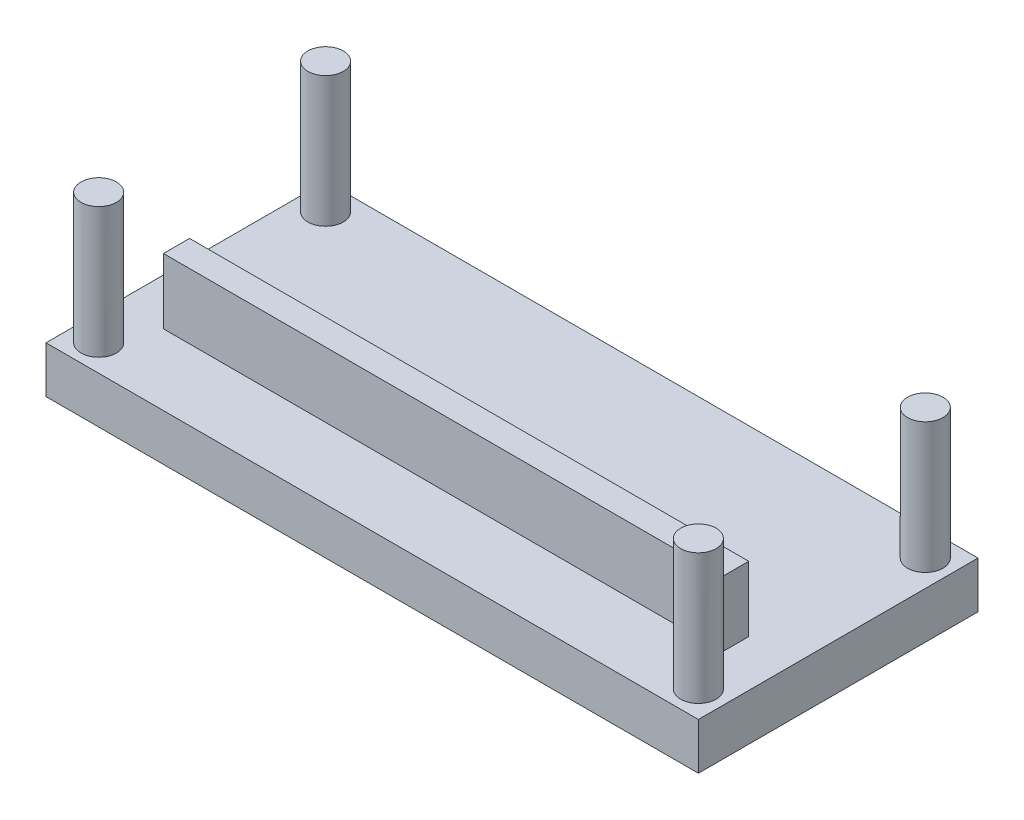
ISO-10303-21;
HEADER;
FILE_DESCRIPTION(('STEP AP214'),'2;1');
FILE_NAME('part.step','',(''),(''),'','','');
FILE_SCHEMA(('AUTOMOTIVE_DESIGN { 1 0 10303 214 1 1 1 1 }'));
ENDSEC;
DATA;
#1=APPLICATION_CONTEXT('core data for automotive mechanical design processes');
#2=APPLICATION_PROTOCOL_DEFINITION('international standard','automotive_design',2000,#1);
#3=PRODUCT_CONTEXT('',#1,'mechanical');
#4=PRODUCT('Part','Part','',(#3));
#5=PRODUCT_RELATED_PRODUCT_CATEGORY('part','',(#4));
#6=PRODUCT_DEFINITION_FORMATION('','',#4);
#7=PRODUCT_DEFINITION_CONTEXT('part definition',#1,'design');
#8=PRODUCT_DEFINITION('design','',#6,#7);
#9=PRODUCT_DEFINITION_SHAPE('','',#8);
#10=(LENGTH_UNIT() NAMED_UNIT(*) SI_UNIT(.MILLI.,.METRE.));
#11=(NAMED_UNIT(*) PLANE_ANGLE_UNIT() SI_UNIT($,.RADIAN.));
#12=(NAMED_UNIT(*) SI_UNIT($,.STERADIAN.) SOLID_ANGLE_UNIT());
#13=UNCERTAINTY_MEASURE_WITH_UNIT(LENGTH_MEASURE(1.E-05),#10,'distance_accuracy_value','');
#14=(GEOMETRIC_REPRESENTATION_CONTEXT(3) GLOBAL_UNCERTAINTY_ASSIGNED_CONTEXT((#13)) GLOBAL_UNIT_ASSIGNED_CONTEXT((#10,
#11,#12)) REPRESENTATION_CONTEXT('',''));
#15=CARTESIAN_POINT('',(0.,0.,0.));
#16=DIRECTION('',(0.,0.,1.));
#17=DIRECTION('',(1.,0.,0.));
#18=AXIS2_PLACEMENT_3D('',#15,#16,#17);
#19=CARTESIAN_POINT('',(70.,15.,0.));
#20=DIRECTION('',(0.,0.,-1.));
#21=DIRECTION('',(-1.,0.,0.));
#22=AXIS2_PLACEMENT_3D('',#19,#20,#21);
#23=PLANE('',#22);
#24=DIRECTION('',(-1.,0.,0.));
#25=VECTOR('',#24,1.);
#26=CARTESIAN_POINT('',(70.,10.,0.));
#27=LINE('',#26,#25);
#28=CARTESIAN_POINT('',(70.,10.,0.));
#29=VERTEX_POINT('',#28);
#30=CARTESIAN_POINT('',(0.,10.,0.));
#31=VERTEX_POINT('',#30);
#32=EDGE_CURVE('E54',#29,#31,#27,.T.);
#33=ORIENTED_EDGE('',*,*,#32,.F.);
#34=DIRECTION('',(0.,-1.,0.));
#35=VECTOR('',#34,1.);
#36=CARTESIAN_POINT('',(70.,15.,0.));
#37=LINE('',#36,#35);
#38=CARTESIAN_POINT('',(70.,15.,0.));
#39=VERTEX_POINT('',#38);
#40=EDGE_CURVE('E131',#39,#29,#37,.T.);
#41=ORIENTED_EDGE('',*,*,#40,.F.);
#42=DIRECTION('',(1.,0.,0.));
#43=VECTOR('',#42,1.);
#44=CARTESIAN_POINT('',(70.,15.,0.));
#45=LINE('',#44,#43);
#46=CARTESIAN_POINT('',(0.,15.,0.));
#47=VERTEX_POINT('',#46);
#48=EDGE_CURVE('E164',#47,#39,#45,.T.);
#49=ORIENTED_EDGE('',*,*,#48,.F.);
#50=DIRECTION('',(0.,-1.,0.));
#51=VECTOR('',#50,1.);
#52=CARTESIAN_POINT('',(0.,15.,0.));
#53=LINE('',#52,#51);
#54=EDGE_CURVE('E127',#47,#31,#53,.T.);
#55=ORIENTED_EDGE('',*,*,#54,.T.);
#56=EDGE_LOOP('',(#33,#41,#49,#55));
#57=FACE_BOUND('',#56,.T.);
#58=ADVANCED_FACE('F39',(#57),#23,.F.);
#59=CARTESIAN_POINT('',(70.,15.,-30.));
#60=DIRECTION('',(-1.,0.,0.));
#61=DIRECTION('',(0.,0.,1.));
#62=AXIS2_PLACEMENT_3D('',#59,#60,#61);
#63=PLANE('',#62);
#64=DIRECTION('',(0.,0.,1.));
#65=VECTOR('',#64,1.);
#66=CARTESIAN_POINT('',(70.,10.,-30.));
#67=LINE('',#66,#65);
#68=CARTESIAN_POINT('',(70.,10.,-30.));
#69=VERTEX_POINT('',#68);
#70=EDGE_CURVE('E122',#69,#29,#67,.T.);
#71=ORIENTED_EDGE('',*,*,#70,.F.);
#72=DIRECTION('',(0.,-1.,0.));
#73=VECTOR('',#72,1.);
#74=CARTESIAN_POINT('',(70.,15.,-30.));
#75=LINE('',#74,#73);
#76=CARTESIAN_POINT('',(70.,15.,-30.));
#77=VERTEX_POINT('',#76);
#78=EDGE_CURVE('E120',#77,#69,#75,.T.);
#79=ORIENTED_EDGE('',*,*,#78,.F.);
#80=DIRECTION('',(0.,0.,-1.));
#81=VECTOR('',#80,1.);
#82=CARTESIAN_POINT('',(70.,15.,-30.));
#83=LINE('',#82,#81);
#84=EDGE_CURVE('E209',#39,#77,#83,.T.);
#85=ORIENTED_EDGE('',*,*,#84,.F.);
#86=ORIENTED_EDGE('',*,*,#40,.T.);
#87=EDGE_LOOP('',(#71,#79,#85,#86));
#88=FACE_BOUND('',#87,.T.);
#89=ADVANCED_FACE('F217',(#88),#63,.F.);
#90=CARTESIAN_POINT('',(0.,15.,-30.));
#91=DIRECTION('',(0.,0.,1.));
#92=DIRECTION('',(1.,0.,0.));
#93=AXIS2_PLACEMENT_3D('',#90,#91,#92);
#94=PLANE('',#93);
#95=DIRECTION('',(1.,0.,0.));
#96=VECTOR('',#95,1.);
#97=CARTESIAN_POINT('',(0.,10.,-30.));
#98=LINE('',#97,#96);
#99=CARTESIAN_POINT('',(0.,10.,-30.));
#100=VERTEX_POINT('',#99);
#101=EDGE_CURVE('E104',#100,#69,#98,.T.);
#102=ORIENTED_EDGE('',*,*,#101,.F.);
#103=DIRECTION('',(0.,-1.,0.));
#104=VECTOR('',#103,1.);
#105=CARTESIAN_POINT('',(0.,15.,-30.));
#106=LINE('',#105,#104);
#107=CARTESIAN_POINT('',(0.,15.,-30.));
#108=VERTEX_POINT('',#107);
#109=EDGE_CURVE('E117',#108,#100,#106,.T.);
#110=ORIENTED_EDGE('',*,*,#109,.F.);
#111=DIRECTION('',(-1.,0.,0.));
#112=VECTOR('',#111,1.);
#113=CARTESIAN_POINT('',(0.,15.,-30.));
#114=LINE('',#113,#112);
#115=EDGE_CURVE('E212',#77,#108,#114,.T.);
#116=ORIENTED_EDGE('',*,*,#115,.F.);
#117=ORIENTED_EDGE('',*,*,#78,.T.);
#118=EDGE_LOOP('',(#102,#110,#116,#117));
#119=FACE_BOUND('',#118,.T.);
#120=ADVANCED_FACE('F115',(#119),#94,.F.);
#121=CARTESIAN_POINT('',(0.,15.,0.));
#122=DIRECTION('',(1.,0.,0.));
#123=DIRECTION('',(0.,0.,-1.));
#124=AXIS2_PLACEMENT_3D('',#121,#122,#123);
#125=PLANE('',#124);
#126=DIRECTION('',(0.,0.,-1.));
#127=VECTOR('',#126,1.);
#128=CARTESIAN_POINT('',(0.,10.,0.));
#129=LINE('',#128,#127);
#130=EDGE_CURVE('E101',#31,#100,#129,.T.);
#131=ORIENTED_EDGE('',*,*,#130,.F.);
#132=ORIENTED_EDGE('',*,*,#54,.F.);
#133=DIRECTION('',(0.,0.,1.));
#134=VECTOR('',#133,1.);
#135=CARTESIAN_POINT('',(0.,15.,0.));
#136=LINE('',#135,#134);
#137=EDGE_CURVE('E125',#108,#47,#136,.T.);
#138=ORIENTED_EDGE('',*,*,#137,.F.);
#139=ORIENTED_EDGE('',*,*,#109,.T.);
#140=EDGE_LOOP('',(#131,#132,#138,#139));
#141=FACE_BOUND('',#140,.T.);
#142=ADVANCED_FACE('F124',(#141),#125,.F.);
#143=CARTESIAN_POINT('',(0.,15.,0.));
#144=DIRECTION('',(0.,-1.,0.));
#145=DIRECTION('',(0.,0.,-1.));
#146=AXIS2_PLACEMENT_3D('',#143,#144,#145);
#147=PLANE('',#146);
#148=CARTESIAN_POINT('',(67.1715728752538,15.,-2.8284271247462));
#149=DIRECTION('',(0.,-1.,0.));
#150=DIRECTION('',(0.,0.,-1.));
#151=AXIS2_PLACEMENT_3D('',#148,#149,#150);
#152=CIRCLE('',#151,1.9);
#153=CARTESIAN_POINT('',(67.1715728752538,15.,-4.7284271247462));
#154=VERTEX_POINT('',#153);
#155=EDGE_CURVE('E11',#154,#154,#152,.F.);
#156=ORIENTED_EDGE('',*,*,#155,.F.);
#157=EDGE_LOOP('',(#156));
#158=FACE_BOUND('',#157,.T.);
#159=CARTESIAN_POINT('',(67.1715728752538,15.,-27.1715728752538));
#160=DIRECTION('',(0.,-1.,0.));
#161=DIRECTION('',(0.,0.,-1.));
#162=AXIS2_PLACEMENT_3D('',#159,#160,#161);
#163=CIRCLE('',#162,1.9);
#164=CARTESIAN_POINT('',(67.1715728752538,15.,-29.0715728752538));
#165=VERTEX_POINT('',#164);
#166=EDGE_CURVE('E47',#165,#165,#163,.F.);
#167=ORIENTED_EDGE('',*,*,#166,.F.);
#168=EDGE_LOOP('',(#167));
#169=FACE_BOUND('',#168,.T.);
#170=CARTESIAN_POINT('',(2.82842712474619,15.,-27.1715728752538));
#171=DIRECTION('',(0.,-1.,0.));
#172=DIRECTION('',(0.,0.,-1.));
#173=AXIS2_PLACEMENT_3D('',#170,#171,#172);
#174=CIRCLE('',#173,1.9);
#175=CARTESIAN_POINT('',(2.82842712474619,15.,-29.0715728752538));
#176=VERTEX_POINT('',#175);
#177=EDGE_CURVE('E143',#176,#176,#174,.F.);
#178=ORIENTED_EDGE('',*,*,#177,.F.);
#179=EDGE_LOOP('',(#178));
#180=FACE_BOUND('',#179,.T.);
#181=CARTESIAN_POINT('',(2.82842712474619,15.,-2.82842712474619));
#182=DIRECTION('',(0.,-1.,0.));
#183=DIRECTION('',(0.,0.,-1.));
#184=AXIS2_PLACEMENT_3D('',#181,#182,#183);
#185=CIRCLE('',#184,1.9);
#186=CARTESIAN_POINT('',(2.82842712474619,15.,-4.72842712474619));
#187=VERTEX_POINT('',#186);
#188=EDGE_CURVE('E139',#187,#187,#185,.F.);
#189=ORIENTED_EDGE('',*,*,#188,.F.);
#190=EDGE_LOOP('',(#189));
#191=FACE_BOUND('',#190,.T.);
#192=ORIENTED_EDGE('',*,*,#48,.T.);
#193=ORIENTED_EDGE('',*,*,#84,.T.);
#194=ORIENTED_EDGE('',*,*,#115,.T.);
#195=ORIENTED_EDGE('',*,*,#137,.T.);
#196=EDGE_LOOP('',(#192,#193,#194,#195));
#197=FACE_BOUND('',#196,.T.);
#198=DIRECTION('',(1.,0.,0.));
#199=VECTOR('',#198,1.);
#200=CARTESIAN_POINT('',(5.,15.,-7.6));
#201=LINE('',#200,#199);
#202=CARTESIAN_POINT('',(5.,15.,-7.6));
#203=VERTEX_POINT('',#202);
#204=CARTESIAN_POINT('',(65.,15.,-7.6));
#205=VERTEX_POINT('',#204);
#206=EDGE_CURVE('E167',#203,#205,#201,.T.);
#207=ORIENTED_EDGE('',*,*,#206,.F.);
#208=DIRECTION('',(0.,0.,1.));
#209=VECTOR('',#208,1.);
#210=CARTESIAN_POINT('',(5.,15.,-10.4));
#211=LINE('',#210,#209);
#212=CARTESIAN_POINT('',(5.,15.,-10.4));
#213=VERTEX_POINT('',#212);
#214=EDGE_CURVE('E169',#213,#203,#211,.T.);
#215=ORIENTED_EDGE('',*,*,#214,.F.);
#216=DIRECTION('',(-1.,0.,0.));
#217=VECTOR('',#216,1.);
#218=CARTESIAN_POINT('',(65.,15.,-10.4));
#219=LINE('',#218,#217);
#220=CARTESIAN_POINT('',(65.,15.,-10.4));
#221=VERTEX_POINT('',#220);
#222=EDGE_CURVE('E187',#221,#213,#219,.T.);
#223=ORIENTED_EDGE('',*,*,#222,.F.);
#224=DIRECTION('',(0.,0.,-1.));
#225=VECTOR('',#224,1.);
#226=CARTESIAN_POINT('',(65.,15.,-7.6));
#227=LINE('',#226,#225);
#228=EDGE_CURVE('E62',#205,#221,#227,.T.);
#229=ORIENTED_EDGE('',*,*,#228,.F.);
#230=EDGE_LOOP('',(#207,#215,#223,#229));
#231=FACE_BOUND('',#230,.T.);
#232=ADVANCED_FACE('F152',(#158,#169,#180,#191,#197,#231),#147,.F.);
#233=CARTESIAN_POINT('',(5.,22.,-7.6));
#234=DIRECTION('',(0.,0.,-1.));
#235=DIRECTION('',(-1.,0.,0.));
#236=AXIS2_PLACEMENT_3D('',#233,#234,#235);
#237=PLANE('',#236);
#238=ORIENTED_EDGE('',*,*,#206,.T.);
#239=DIRECTION('',(0.,-1.,0.));
#240=VECTOR('',#239,1.);
#241=CARTESIAN_POINT('',(65.,22.,-7.6));
#242=LINE('',#241,#240);
#243=CARTESIAN_POINT('',(65.,22.,-7.6));
#244=VERTEX_POINT('',#243);
#245=EDGE_CURVE('E204',#244,#205,#242,.T.);
#246=ORIENTED_EDGE('',*,*,#245,.F.);
#247=DIRECTION('',(1.,0.,0.));
#248=VECTOR('',#247,1.);
#249=CARTESIAN_POINT('',(5.,22.,-7.6));
#250=LINE('',#249,#248);
#251=CARTESIAN_POINT('',(5.,22.,-7.6));
#252=VERTEX_POINT('',#251);
#253=EDGE_CURVE('E186',#252,#244,#250,.T.);
#254=ORIENTED_EDGE('',*,*,#253,.F.);
#255=DIRECTION('',(0.,-1.,0.));
#256=VECTOR('',#255,1.);
#257=CARTESIAN_POINT('',(5.,22.,-7.6));
#258=LINE('',#257,#256);
#259=EDGE_CURVE('E181',#252,#203,#258,.T.);
#260=ORIENTED_EDGE('',*,*,#259,.T.);
#261=EDGE_LOOP('',(#238,#246,#254,#260));
#262=FACE_BOUND('',#261,.T.);
#263=ADVANCED_FACE('F155',(#262),#237,.F.);
#264=CARTESIAN_POINT('',(65.,22.,-7.6));
#265=DIRECTION('',(-1.,0.,0.));
#266=DIRECTION('',(0.,0.,1.));
#267=AXIS2_PLACEMENT_3D('',#264,#265,#266);
#268=PLANE('',#267);
#269=ORIENTED_EDGE('',*,*,#228,.T.);
#270=DIRECTION('',(0.,-1.,0.));
#271=VECTOR('',#270,1.);
#272=CARTESIAN_POINT('',(65.,22.,-10.4));
#273=LINE('',#272,#271);
#274=CARTESIAN_POINT('',(65.,22.,-10.4));
#275=VERTEX_POINT('',#274);
#276=EDGE_CURVE('E195',#275,#221,#273,.T.);
#277=ORIENTED_EDGE('',*,*,#276,.F.);
#278=DIRECTION('',(0.,0.,-1.));
#279=VECTOR('',#278,1.);
#280=CARTESIAN_POINT('',(65.,22.,-7.6));
#281=LINE('',#280,#279);
#282=EDGE_CURVE('E223',#244,#275,#281,.T.);
#283=ORIENTED_EDGE('',*,*,#282,.F.);
#284=ORIENTED_EDGE('',*,*,#245,.T.);
#285=EDGE_LOOP('',(#269,#277,#283,#284));
#286=FACE_BOUND('',#285,.T.);
#287=ADVANCED_FACE('F235',(#286),#268,.F.);
#288=CARTESIAN_POINT('',(65.,22.,-10.4));
#289=DIRECTION('',(0.,0.,1.));
#290=DIRECTION('',(1.,0.,0.));
#291=AXIS2_PLACEMENT_3D('',#288,#289,#290);
#292=PLANE('',#291);
#293=ORIENTED_EDGE('',*,*,#222,.T.);
#294=DIRECTION('',(0.,-1.,0.));
#295=VECTOR('',#294,1.);
#296=CARTESIAN_POINT('',(5.,22.,-10.4));
#297=LINE('',#296,#295);
#298=CARTESIAN_POINT('',(5.,22.,-10.4));
#299=VERTEX_POINT('',#298);
#300=EDGE_CURVE('E184',#299,#213,#297,.T.);
#301=ORIENTED_EDGE('',*,*,#300,.F.);
#302=DIRECTION('',(-1.,0.,0.));
#303=VECTOR('',#302,1.);
#304=CARTESIAN_POINT('',(65.,22.,-10.4));
#305=LINE('',#304,#303);
#306=EDGE_CURVE('E197',#275,#299,#305,.T.);
#307=ORIENTED_EDGE('',*,*,#306,.F.);
#308=ORIENTED_EDGE('',*,*,#276,.T.);
#309=EDGE_LOOP('',(#293,#301,#307,#308));
#310=FACE_BOUND('',#309,.T.);
#311=ADVANCED_FACE('F231',(#310),#292,.F.);
#312=CARTESIAN_POINT('',(5.,22.,-10.4));
#313=DIRECTION('',(1.,0.,0.));
#314=DIRECTION('',(0.,0.,-1.));
#315=AXIS2_PLACEMENT_3D('',#312,#313,#314);
#316=PLANE('',#315);
#317=ORIENTED_EDGE('',*,*,#214,.T.);
#318=ORIENTED_EDGE('',*,*,#259,.F.);
#319=DIRECTION('',(0.,0.,1.));
#320=VECTOR('',#319,1.);
#321=CARTESIAN_POINT('',(5.,22.,-10.4));
#322=LINE('',#321,#320);
#323=EDGE_CURVE('E191',#299,#252,#322,.T.);
#324=ORIENTED_EDGE('',*,*,#323,.F.);
#325=ORIENTED_EDGE('',*,*,#300,.T.);
#326=EDGE_LOOP('',(#317,#318,#324,#325));
#327=FACE_BOUND('',#326,.T.);
#328=ADVANCED_FACE('F179',(#327),#316,.F.);
#329=CARTESIAN_POINT('',(0.,22.,0.));
#330=DIRECTION('',(0.,1.,0.));
#331=DIRECTION('',(0.,0.,1.));
#332=AXIS2_PLACEMENT_3D('',#329,#330,#331);
#333=PLANE('',#332);
#334=ORIENTED_EDGE('',*,*,#253,.T.);
#335=ORIENTED_EDGE('',*,*,#282,.T.);
#336=ORIENTED_EDGE('',*,*,#306,.T.);
#337=ORIENTED_EDGE('',*,*,#323,.T.);
#338=EDGE_LOOP('',(#334,#335,#336,#337));
#339=FACE_BOUND('',#338,.T.);
#340=ADVANCED_FACE('F237',(#339),#333,.T.);
#341=CARTESIAN_POINT('',(0.,10.,0.));
#342=DIRECTION('',(0.,-1.,0.));
#343=DIRECTION('',(0.,0.,-1.));
#344=AXIS2_PLACEMENT_3D('',#341,#342,#343);
#345=PLANE('',#344);
#346=ORIENTED_EDGE('',*,*,#32,.T.);
#347=ORIENTED_EDGE('',*,*,#130,.T.);
#348=ORIENTED_EDGE('',*,*,#101,.T.);
#349=ORIENTED_EDGE('',*,*,#70,.T.);
#350=EDGE_LOOP('',(#346,#347,#348,#349));
#351=FACE_BOUND('',#350,.T.);
#352=ADVANCED_FACE('F103',(#351),#345,.T.);
#353=CARTESIAN_POINT('',(2.82842712474619,29.,-2.82842712474619));
#354=DIRECTION('',(0.,-1.,0.));
#355=DIRECTION('',(0.,0.,-1.));
#356=AXIS2_PLACEMENT_3D('',#353,#354,#355);
#357=CYLINDRICAL_SURFACE('',#356,1.9);
#358=CARTESIAN_POINT('',(2.82842712474619,29.,-2.82842712474619));
#359=DIRECTION('',(0.,1.,0.));
#360=DIRECTION('',(0.,0.,1.));
#361=AXIS2_PLACEMENT_3D('',#358,#359,#360);
#362=CIRCLE('',#361,1.9);
#363=CARTESIAN_POINT('',(2.82842712474619,29.,-0.92842712474619));
#364=VERTEX_POINT('',#363);
#365=EDGE_CURVE('E404',#364,#364,#362,.T.);
#366=ORIENTED_EDGE('',*,*,#365,.F.);
#367=EDGE_LOOP('',(#366));
#368=FACE_BOUND('',#367,.T.);
#369=ORIENTED_EDGE('',*,*,#188,.T.);
#370=EDGE_LOOP('',(#369));
#371=FACE_BOUND('',#370,.T.);
#372=ADVANCED_FACE('F244',(#368,#371),#357,.T.);
#373=CARTESIAN_POINT('',(2.82842712474619,29.,-2.82842712474619));
#374=DIRECTION('',(0.,1.,0.));
#375=DIRECTION('',(0.,0.,1.));
#376=AXIS2_PLACEMENT_3D('',#373,#374,#375);
#377=PLANE('',#376);
#378=ORIENTED_EDGE('',*,*,#365,.T.);
#379=EDGE_LOOP('',(#378));
#380=FACE_BOUND('',#379,.T.);
#381=ADVANCED_FACE('F317',(#380),#377,.T.);
#382=CARTESIAN_POINT('',(2.82842712474619,29.,-27.1715728752538));
#383=DIRECTION('',(0.,-1.,0.));
#384=DIRECTION('',(0.,0.,-1.));
#385=AXIS2_PLACEMENT_3D('',#382,#383,#384);
#386=CYLINDRICAL_SURFACE('',#385,1.9);
#387=CARTESIAN_POINT('',(2.82842712474619,29.,-27.1715728752538));
#388=DIRECTION('',(0.,1.,0.));
#389=DIRECTION('',(0.,0.,1.));
#390=AXIS2_PLACEMENT_3D('',#387,#388,#389);
#391=CIRCLE('',#390,1.9);
#392=CARTESIAN_POINT('',(2.82842712474619,29.,-25.2715728752538));
#393=VERTEX_POINT('',#392);
#394=EDGE_CURVE('E398',#393,#393,#391,.T.);
#395=ORIENTED_EDGE('',*,*,#394,.F.);
#396=EDGE_LOOP('',(#395));
#397=FACE_BOUND('',#396,.T.);
#398=ORIENTED_EDGE('',*,*,#177,.T.);
#399=EDGE_LOOP('',(#398));
#400=FACE_BOUND('',#399,.T.);
#401=ADVANCED_FACE('F327',(#397,#400),#386,.T.);
#402=CARTESIAN_POINT('',(2.82842712474619,29.,-27.1715728752538));
#403=DIRECTION('',(0.,1.,0.));
#404=DIRECTION('',(0.,0.,1.));
#405=AXIS2_PLACEMENT_3D('',#402,#403,#404);
#406=PLANE('',#405);
#407=ORIENTED_EDGE('',*,*,#394,.T.);
#408=EDGE_LOOP('',(#407));
#409=FACE_BOUND('',#408,.T.);
#410=ADVANCED_FACE('F337',(#409),#406,.T.);
#411=CARTESIAN_POINT('',(67.1715728752538,29.,-27.1715728752538));
#412=DIRECTION('',(0.,-1.,0.));
#413=DIRECTION('',(0.,0.,-1.));
#414=AXIS2_PLACEMENT_3D('',#411,#412,#413);
#415=CYLINDRICAL_SURFACE('',#414,1.9);
#416=CARTESIAN_POINT('',(67.1715728752538,29.,-27.1715728752538));
#417=DIRECTION('',(0.,1.,0.));
#418=DIRECTION('',(0.,0.,1.));
#419=AXIS2_PLACEMENT_3D('',#416,#417,#418);
#420=CIRCLE('',#419,1.9);
#421=CARTESIAN_POINT('',(67.1715728752538,29.,-25.2715728752538));
#422=VERTEX_POINT('',#421);
#423=EDGE_CURVE('E394',#422,#422,#420,.T.);
#424=ORIENTED_EDGE('',*,*,#423,.F.);
#425=EDGE_LOOP('',(#424));
#426=FACE_BOUND('',#425,.T.);
#427=ORIENTED_EDGE('',*,*,#166,.T.);
#428=EDGE_LOOP('',(#427));
#429=FACE_BOUND('',#428,.T.);
#430=ADVANCED_FACE('F150',(#426,#429),#415,.T.);
#431=CARTESIAN_POINT('',(67.1715728752538,29.,-27.1715728752538));
#432=DIRECTION('',(0.,1.,0.));
#433=DIRECTION('',(0.,0.,1.));
#434=AXIS2_PLACEMENT_3D('',#431,#432,#433);
#435=PLANE('',#434);
#436=ORIENTED_EDGE('',*,*,#423,.T.);
#437=EDGE_LOOP('',(#436));
#438=FACE_BOUND('',#437,.T.);
#439=ADVANCED_FACE('F356',(#438),#435,.T.);
#440=CARTESIAN_POINT('',(67.1715728752538,29.,-2.8284271247462));
#441=DIRECTION('',(0.,-1.,0.));
#442=DIRECTION('',(0.,0.,-1.));
#443=AXIS2_PLACEMENT_3D('',#440,#441,#442);
#444=CYLINDRICAL_SURFACE('',#443,1.9);
#445=CARTESIAN_POINT('',(67.1715728752538,29.,-2.8284271247462));
#446=DIRECTION('',(0.,1.,0.));
#447=DIRECTION('',(0.,0.,1.));
#448=AXIS2_PLACEMENT_3D('',#445,#446,#447);
#449=CIRCLE('',#448,1.9);
#450=CARTESIAN_POINT('',(67.1715728752538,29.,-0.928427124746195));
#451=VERTEX_POINT('',#450);
#452=EDGE_CURVE('E392',#451,#451,#449,.T.);
#453=ORIENTED_EDGE('',*,*,#452,.F.);
#454=EDGE_LOOP('',(#453));
#455=FACE_BOUND('',#454,.T.);
#456=ORIENTED_EDGE('',*,*,#155,.T.);
#457=EDGE_LOOP('',(#456));
#458=FACE_BOUND('',#457,.T.);
#459=ADVANCED_FACE('F366',(#455,#458),#444,.T.);
#460=CARTESIAN_POINT('',(67.1715728752538,29.,-2.8284271247462));
#461=DIRECTION('',(0.,1.,0.));
#462=DIRECTION('',(0.,0.,1.));
#463=AXIS2_PLACEMENT_3D('',#460,#461,#462);
#464=PLANE('',#463);
#465=ORIENTED_EDGE('',*,*,#452,.T.);
#466=EDGE_LOOP('',(#465));
#467=FACE_BOUND('',#466,.T.);
#468=ADVANCED_FACE('F376',(#467),#464,.T.);
#469=CLOSED_SHELL('',(#58,#89,#120,#142,#232,#263,#287,#311,#328,#340,#352,#372,#381,#401,#410,
#430,#439,#459,#468));
#470=MANIFOLD_SOLID_BREP('B2',#469);
#471=ADVANCED_BREP_SHAPE_REPRESENTATION('',(#18,#470),#14);
#472=SHAPE_DEFINITION_REPRESENTATION(#9,#471);
ENDSEC;
END-ISO-10303-21;
